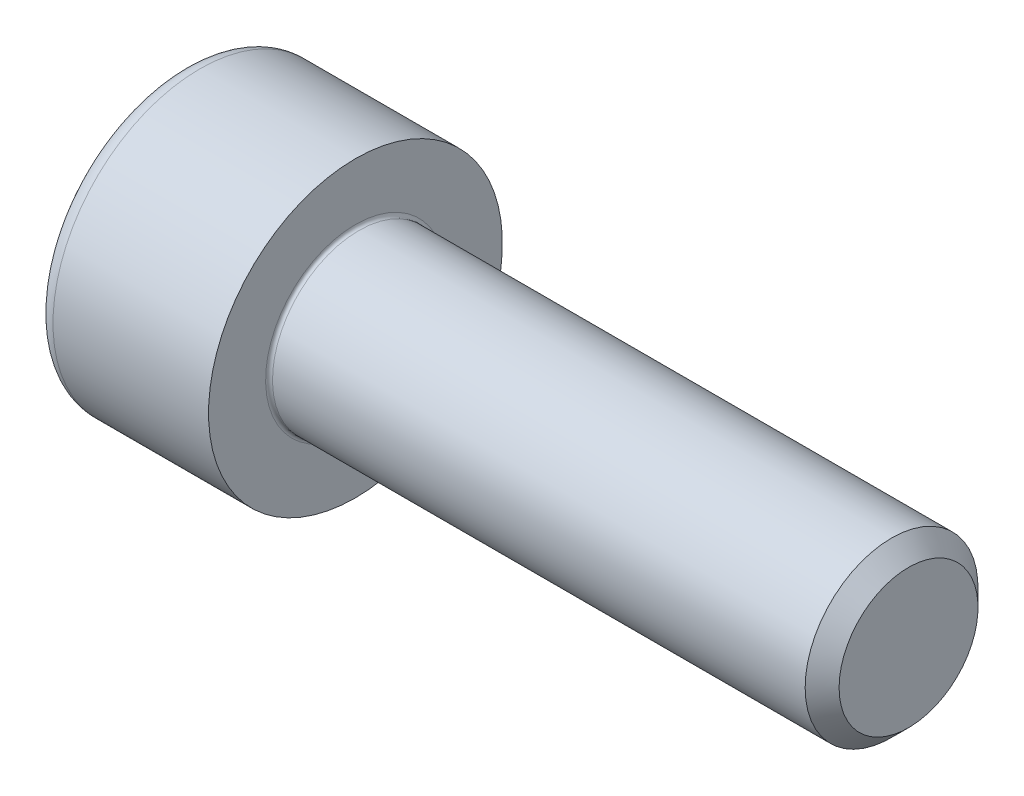
ISO-10303-21;
HEADER;
FILE_DESCRIPTION(('STEP AP214'),'2;1');
FILE_NAME('part.step','',(''),(''),'','','');
FILE_SCHEMA(('AUTOMOTIVE_DESIGN { 1 0 10303 214 1 1 1 1 }'));
ENDSEC;
DATA;
#1=APPLICATION_CONTEXT('core data for automotive mechanical design processes');
#2=APPLICATION_PROTOCOL_DEFINITION('international standard','automotive_design',2000,#1);
#3=PRODUCT_CONTEXT('',#1,'mechanical');
#4=PRODUCT('Part','Part','',(#3));
#5=PRODUCT_RELATED_PRODUCT_CATEGORY('part','',(#4));
#6=PRODUCT_DEFINITION_FORMATION('','',#4);
#7=PRODUCT_DEFINITION_CONTEXT('part definition',#1,'design');
#8=PRODUCT_DEFINITION('design','',#6,#7);
#9=PRODUCT_DEFINITION_SHAPE('','',#8);
#10=(LENGTH_UNIT() NAMED_UNIT(*) SI_UNIT(.MILLI.,.METRE.));
#11=(NAMED_UNIT(*) PLANE_ANGLE_UNIT() SI_UNIT($,.RADIAN.));
#12=(NAMED_UNIT(*) SI_UNIT($,.STERADIAN.) SOLID_ANGLE_UNIT());
#13=UNCERTAINTY_MEASURE_WITH_UNIT(LENGTH_MEASURE(1.E-05),#10,'distance_accuracy_value','');
#14=(GEOMETRIC_REPRESENTATION_CONTEXT(3) GLOBAL_UNCERTAINTY_ASSIGNED_CONTEXT((#13)) GLOBAL_UNIT_ASSIGNED_CONTEXT((#10,
#11,#12)) REPRESENTATION_CONTEXT('',''));
#15=CARTESIAN_POINT('',(0.,0.,0.));
#16=DIRECTION('',(0.,0.,1.));
#17=DIRECTION('',(1.,0.,0.));
#18=AXIS2_PLACEMENT_3D('',#15,#16,#17);
#19=CARTESIAN_POINT('',(-2.50800000134177,0.,0.));
#20=DIRECTION('',(-1.,0.,0.));
#21=DIRECTION('',(0.,0.,1.));
#22=AXIS2_PLACEMENT_3D('',#19,#20,#21);
#23=CONICAL_SURFACE('',#22,2.32325748231688,1.04719754999306);
#24=CARTESIAN_POINT('',(-1.16666666480114,0.,0.));
#25=VERTEX_POINT('',#24);
#26=VERTEX_LOOP('',#25);
#27=FACE_BOUND('',#26,.T.);
#28=CARTESIAN_POINT('',(-2.50000000149329,2.00000000034012,1.15470053794817));
#29=CARTESIAN_POINT('',(-2.47069554668119,2.00000000012216,1.05321634683028));
#30=CARTESIAN_POINT('',(-2.44404467864461,2.00000000003274,0.950856145634218));
#31=CARTESIAN_POINT('',(-2.39752638887454,1.99999999996718,0.744363444835553));
#32=CARTESIAN_POINT('',(-2.37767542175251,1.99999999999131,0.640227277451577));
#33=CARTESIAN_POINT('',(-2.34677596028924,2.00000000000847,0.433245450002578));
#34=CARTESIAN_POINT('',(-2.33552178892674,2.00000000000226,0.330431627824063));
#35=CARTESIAN_POINT('',(-2.32208916945702,1.99999999999774,0.124320462859062));
#36=CARTESIAN_POINT('',(-2.31989959531066,1.99999999999944,0.0210238687165898));
#37=CARTESIAN_POINT('',(-2.32446629153409,2.00000000000049,-0.171974735955581));
#38=CARTESIAN_POINT('',(-2.33010128661813,2.00000000000013,-0.261705707498746));
#39=CARTESIAN_POINT('',(-2.34795730216982,1.99999999999987,-0.440583082572412));
#40=CARTESIAN_POINT('',(-2.36018441624762,1.99999999999996,-0.529728867875609));
#41=CARTESIAN_POINT('',(-2.39074983487721,2.00000000000004,-0.708974747210316));
#42=CARTESIAN_POINT('',(-2.40921764379032,2.00000000000002,-0.799052166700933));
#43=CARTESIAN_POINT('',(-2.45113176248065,1.99999999999998,-0.977863889537872));
#44=CARTESIAN_POINT('',(-2.47456823042956,1.99999999999996,-1.06660048190195));
#45=CARTESIAN_POINT('',(-2.50000000171445,2.,-1.15470053794294));
#46=B_SPLINE_CURVE_WITH_KNOTS('',3,(#28,#29,#30,#31,#32,#33,#34,#35,#36,#37,#38,#39,#40,#41,#42,
#43,#44,#45),.UNSPECIFIED.,.F.,.F.,(4,2,2,2,2,2,2,2,4),(0.,0.317016011610323,0.634793817145274,
0.944707606303263,1.25424088907513,1.5237077825656,1.79342419348694,2.06912162195376,
2.34427797274837),.UNSPECIFIED.);
#47=CARTESIAN_POINT('',(-2.50000000169884,1.99999999978765,1.15470053825665));
#48=VERTEX_POINT('',#47);
#49=CARTESIAN_POINT('',(-2.50000000176962,2.,-1.15470053813405));
#50=VERTEX_POINT('',#49);
#51=EDGE_CURVE('E21',#48,#50,#46,.T.);
#52=ORIENTED_EDGE('',*,*,#51,.T.);
#53=CARTESIAN_POINT('',(-2.50000000149329,1.99999999979674,-1.15470053888935));
#54=CARTESIAN_POINT('',(-2.4706955466812,1.91211211209714,-1.20544263425953));
#55=CARTESIAN_POINT('',(-2.44404467864461,1.82346557748016,-1.25662273478012));
#56=CARTESIAN_POINT('',(-2.39752638887454,1.64463765285968,-1.35986908512268));
#57=CARTESIAN_POINT('',(-2.37767542175251,1.55445308646447,-1.41193716883556));
#58=CARTESIAN_POINT('',(-2.34677596028924,1.37520156578049,-1.51542808257493));
#59=CARTESIAN_POINT('',(-2.33552178892674,1.28616218391061,-1.5668349936588));
#60=CARTESIAN_POINT('',(-2.32208916945702,1.10766467904506,-1.66989057613739));
#61=CARTESIAN_POINT('',(-2.31989959531066,1.01820720439411,-1.72153887321009));
#62=CARTESIAN_POINT('',(-2.32446629153409,0.851065509853594,-1.81803817554709));
#63=CARTESIAN_POINT('',(-2.33010128661813,0.773356208990774,-1.86290366131836));
#64=CARTESIAN_POINT('',(-2.34795730216982,0.618443858014569,-1.95234234885497));
#65=CARTESIAN_POINT('',(-2.36018441624762,0.541241343301734,-1.99691524150665));
#66=CARTESIAN_POINT('',(-2.39074983487721,0.386009858274237,-2.08653818117407));
#67=CARTESIAN_POINT('',(-2.40921764379032,0.308000524688005,-2.13157689091936));
#68=CARTESIAN_POINT('',(-2.45113176248065,0.153145030216733,-2.2209827523378));
#69=CARTESIAN_POINT('',(-2.47456823042956,0.0762968869841689,-2.26535104851982));
#70=CARTESIAN_POINT('',(-2.50000000171445,3.77860756863965E-10,-2.30940107654035));
#71=B_SPLINE_CURVE_WITH_KNOTS('',3,(#53,#54,#55,#56,#57,#58,#59,#60,#61,#62,#63,#64,#65,#66,#67,
#68,#69,#70),.UNSPECIFIED.,.F.,.F.,(4,2,2,2,2,2,2,2,4),(0.,0.317016011610322,0.634793817145273,
0.944707606303263,1.25424088907513,1.5237077825656,1.79342419348694,2.06912162195376,
2.34427797274837),.UNSPECIFIED.);
#72=CARTESIAN_POINT('',(-2.50000000169884,0.,-2.3094010765133));
#73=VERTEX_POINT('',#72);
#74=EDGE_CURVE('E81',#50,#73,#71,.T.);
#75=ORIENTED_EDGE('',*,*,#74,.T.);
#76=CARTESIAN_POINT('',(-2.50000000149329,-5.43384201159472E-10,-2.30940107683752));
#77=CARTESIAN_POINT('',(-2.4706955466812,-0.0878878880250129,-2.25865898108981));
#78=CARTESIAN_POINT('',(-2.44404467864461,-0.176534422552579,-2.20747888041434));
#79=CARTESIAN_POINT('',(-2.39752638887454,-0.355362347107503,-2.10423252995823));
#80=CARTESIAN_POINT('',(-2.37767542175251,-0.44554691352684,-2.05216444628714));
#81=CARTESIAN_POINT('',(-2.34677596028924,-0.624798434227981,-1.94867353257751));
#82=CARTESIAN_POINT('',(-2.33552178892674,-0.713837816091643,-1.89726662148287));
#83=CARTESIAN_POINT('',(-2.32208916945702,-0.892335320952682,-1.79421103899646));
#84=CARTESIAN_POINT('',(-2.31989959531066,-0.981792795605319,-1.74256274192668));
#85=CARTESIAN_POINT('',(-2.32446629153409,-1.1489344901469,-1.64606343959152));
#86=CARTESIAN_POINT('',(-2.33010128661813,-1.22664379100936,-1.60119795381962));
#87=CARTESIAN_POINT('',(-2.34795730216982,-1.3815561419853,-1.51175926628256));
#88=CARTESIAN_POINT('',(-2.36018441624762,-1.45875865669823,-1.46718637363104));
#89=CARTESIAN_POINT('',(-2.39074983487721,-1.6139901417258,-1.37756343396375));
#90=CARTESIAN_POINT('',(-2.40921764379032,-1.69199947531202,-1.33252472421843));
#91=CARTESIAN_POINT('',(-2.45113176248065,-1.84685496978325,-1.24311886279993));
#92=CARTESIAN_POINT('',(-2.47456823042956,-1.92370311301579,-1.19875056661787));
#93=CARTESIAN_POINT('',(-2.50000000171445,-1.99999999962214,-1.15470053859741));
#94=B_SPLINE_CURVE_WITH_KNOTS('',3,(#76,#77,#78,#79,#80,#81,#82,#83,#84,#85,#86,#87,#88,#89,#90,
#91,#92,#93),.UNSPECIFIED.,.F.,.F.,(4,2,2,2,2,2,2,2,4),(0.,0.317016011610323,0.634793817145273,
0.944707606303263,1.25424088907513,1.5237077825656,1.79342419348695,2.06912162195376,
2.34427797274837),.UNSPECIFIED.);
#95=CARTESIAN_POINT('',(-2.50000000169884,-1.99999999978765,-1.15470053825665));
#96=VERTEX_POINT('',#95);
#97=EDGE_CURVE('E106',#73,#96,#94,.T.);
#98=ORIENTED_EDGE('',*,*,#97,.T.);
#99=CARTESIAN_POINT('',(-2.50000000149329,-2.00000000034012,-1.15470053794818));
#100=CARTESIAN_POINT('',(-2.4706955466812,-2.00000000012216,-1.05321634683028));
#101=CARTESIAN_POINT('',(-2.44404467864461,-2.00000000003274,-0.95085614563422));
#102=CARTESIAN_POINT('',(-2.39752638887454,-1.99999999996718,-0.744363444835555));
#103=CARTESIAN_POINT('',(-2.37767542175251,-1.99999999999131,-0.640227277451579));
#104=CARTESIAN_POINT('',(-2.34677596028924,-2.00000000000847,-0.43324545000258));
#105=CARTESIAN_POINT('',(-2.33552178892674,-2.00000000000226,-0.330431627824065));
#106=CARTESIAN_POINT('',(-2.32208916945702,-1.99999999999774,-0.124320462859064));
#107=CARTESIAN_POINT('',(-2.31989959531066,-1.99999999999944,-0.0210238687165921));
#108=CARTESIAN_POINT('',(-2.32446629153409,-2.00000000000049,0.171974735955579));
#109=CARTESIAN_POINT('',(-2.33010128661813,-2.00000000000013,0.261705707498744));
#110=CARTESIAN_POINT('',(-2.34795730216982,-1.99999999999987,0.440583082572411));
#111=CARTESIAN_POINT('',(-2.36018441624762,-1.99999999999996,0.529728867875608));
#112=CARTESIAN_POINT('',(-2.39074983487721,-2.00000000000004,0.708974747210314));
#113=CARTESIAN_POINT('',(-2.40921764379032,-2.00000000000002,0.799052166700932));
#114=CARTESIAN_POINT('',(-2.45113176248065,-1.99999999999998,0.977863889537871));
#115=CARTESIAN_POINT('',(-2.47456823042956,-1.99999999999996,1.06660048190195));
#116=CARTESIAN_POINT('',(-2.50000000171445,-2.,1.15470053794294));
#117=B_SPLINE_CURVE_WITH_KNOTS('',3,(#99,#100,#101,#102,#103,#104,#105,#106,#107,#108,#109,#110,
#111,#112,#113,#114,#115,#116),.UNSPECIFIED.,.F.,.F.,(4,2,2,2,2,2,2,2,4),(0.,0.317016011610323,
0.634793817145274,0.944707606303263,1.25424088907513,1.5237077825656,1.79342419348695,
2.06912162195376,2.34427797274837),.UNSPECIFIED.);
#118=CARTESIAN_POINT('',(-2.50000000169884,-1.99999999978765,1.15470053825665));
#119=VERTEX_POINT('',#118);
#120=EDGE_CURVE('E130',#96,#119,#117,.T.);
#121=ORIENTED_EDGE('',*,*,#120,.T.);
#122=CARTESIAN_POINT('',(-2.50000000149329,-1.99999999979674,1.15470053888934));
#123=CARTESIAN_POINT('',(-2.4706955466812,-1.91211211209714,1.20544263425953));
#124=CARTESIAN_POINT('',(-2.44404467864461,-1.82346557748016,1.25662273478012));
#125=CARTESIAN_POINT('',(-2.39752638887454,-1.64463765285968,1.35986908512268));
#126=CARTESIAN_POINT('',(-2.37767542175251,-1.55445308646447,1.41193716883556));
#127=CARTESIAN_POINT('',(-2.34677596028924,-1.37520156578049,1.51542808257493));
#128=CARTESIAN_POINT('',(-2.33552178892674,-1.28616218391062,1.5668349936588));
#129=CARTESIAN_POINT('',(-2.32208916945702,-1.10766467904506,1.66989057613739));
#130=CARTESIAN_POINT('',(-2.31989959531066,-1.01820720439412,1.72153887321009));
#131=CARTESIAN_POINT('',(-2.32446629153409,-0.851065509853595,1.81803817554709));
#132=CARTESIAN_POINT('',(-2.33010128661813,-0.773356208990775,1.86290366131836));
#133=CARTESIAN_POINT('',(-2.34795730216982,-0.61844385801457,1.95234234885497));
#134=CARTESIAN_POINT('',(-2.36018441624762,-0.541241343301735,1.99691524150665));
#135=CARTESIAN_POINT('',(-2.39074983487721,-0.386009858274237,2.08653818117407));
#136=CARTESIAN_POINT('',(-2.40921764379032,-0.308000524688005,2.13157689091936));
#137=CARTESIAN_POINT('',(-2.45113176248065,-0.153145030216734,2.2209827523378));
#138=CARTESIAN_POINT('',(-2.47456823042956,-0.0762968869841696,2.26535104851982));
#139=CARTESIAN_POINT('',(-2.50000000171445,-3.7786149508116E-10,2.30940107654035));
#140=B_SPLINE_CURVE_WITH_KNOTS('',3,(#122,#123,#124,#125,#126,#127,#128,#129,#130,#131,#132,
#133,#134,#135,#136,#137,#138,#139),.UNSPECIFIED.,.F.,.F.,(4,2,2,2,2,2,2,2,4),(0.,
0.317016011610323,0.634793817145273,0.944707606303263,1.25424088907513,1.5237077825656,
1.79342419348695,2.06912162195376,2.34427797274837),.UNSPECIFIED.);
#141=CARTESIAN_POINT('',(-2.50000000169884,0.,2.3094010765133));
#142=VERTEX_POINT('',#141);
#143=EDGE_CURVE('E138',#119,#142,#140,.T.);
#144=ORIENTED_EDGE('',*,*,#143,.T.);
#145=CARTESIAN_POINT('',(-2.50000000149329,5.43384277631809E-10,2.30940107683752));
#146=CARTESIAN_POINT('',(-2.47069554668119,0.0878878880250131,2.25865898108981));
#147=CARTESIAN_POINT('',(-2.44404467864461,0.176534422552579,2.20747888041434));
#148=CARTESIAN_POINT('',(-2.39752638887454,0.355362347107503,2.10423252995823));
#149=CARTESIAN_POINT('',(-2.37767542175251,0.44554691352684,2.05216444628714));
#150=CARTESIAN_POINT('',(-2.34677596028924,0.624798434227981,1.9486735325775));
#151=CARTESIAN_POINT('',(-2.33552178892674,0.713837816091643,1.89726662148287));
#152=CARTESIAN_POINT('',(-2.32208916945702,0.892335320952682,1.79421103899645));
#153=CARTESIAN_POINT('',(-2.31989959531066,0.981792795605319,1.74256274192668));
#154=CARTESIAN_POINT('',(-2.32446629153409,1.1489344901469,1.64606343959151));
#155=CARTESIAN_POINT('',(-2.33010128661813,1.22664379100936,1.60119795381962));
#156=CARTESIAN_POINT('',(-2.34795730216982,1.3815561419853,1.51175926628256));
#157=CARTESIAN_POINT('',(-2.36018441624761,1.45875865669823,1.46718637363104));
#158=CARTESIAN_POINT('',(-2.39074983487721,1.6139901417258,1.37756343396375));
#159=CARTESIAN_POINT('',(-2.40921764379032,1.69199947531201,1.33252472421843));
#160=CARTESIAN_POINT('',(-2.45113176248065,1.84685496978325,1.24311886279992));
#161=CARTESIAN_POINT('',(-2.47456823042956,1.92370311301579,1.19875056661787));
#162=CARTESIAN_POINT('',(-2.50000000171445,1.99999999962214,1.15470053859741));
#163=B_SPLINE_CURVE_WITH_KNOTS('',3,(#145,#146,#147,#148,#149,#150,#151,#152,#153,#154,#155,
#156,#157,#158,#159,#160,#161,#162),.UNSPECIFIED.,.F.,.F.,(4,2,2,2,2,2,2,2,4),(0.,
0.317016011610323,0.634793817145273,0.944707606303263,1.25424088907513,1.5237077825656,
1.79342419348695,2.06912162195376,2.34427797274837),.UNSPECIFIED.);
#164=EDGE_CURVE('E83',#142,#48,#163,.T.);
#165=ORIENTED_EDGE('',*,*,#164,.T.);
#166=EDGE_LOOP('',(#52,#75,#98,#121,#144,#165));
#167=FACE_BOUND('',#166,.T.);
#168=ADVANCED_FACE('F17',(#27,#167),#23,.F.);
#169=CARTESIAN_POINT('',(-5.,2.,1.15470053837925));
#170=DIRECTION('',(0.,1.,0.));
#171=DIRECTION('',(0.,0.,1.));
#172=AXIS2_PLACEMENT_3D('',#169,#170,#171);
#173=PLANE('',#172);
#174=DIRECTION('',(1.,0.,0.));
#175=VECTOR('',#174,1.);
#176=CARTESIAN_POINT('',(-5.,2.,1.15470053837925));
#177=LINE('',#176,#175);
#178=CARTESIAN_POINT('',(-5.,2.,1.15470053837925));
#179=VERTEX_POINT('',#178);
#180=EDGE_CURVE('E85',#48,#179,#177,.F.);
#181=ORIENTED_EDGE('',*,*,#180,.T.);
#182=DIRECTION('',(0.,0.,1.));
#183=VECTOR('',#182,1.);
#184=CARTESIAN_POINT('',(-5.,2.,0.));
#185=LINE('',#184,#183);
#186=CARTESIAN_POINT('',(-5.,2.,-1.15470053837925));
#187=VERTEX_POINT('',#186);
#188=EDGE_CURVE('E90',#187,#179,#185,.T.);
#189=ORIENTED_EDGE('',*,*,#188,.F.);
#190=DIRECTION('',(1.,0.,0.));
#191=VECTOR('',#190,1.);
#192=CARTESIAN_POINT('',(-5.,2.,-1.15470053837925));
#193=LINE('',#192,#191);
#194=EDGE_CURVE('E88',#187,#50,#193,.T.);
#195=ORIENTED_EDGE('',*,*,#194,.T.);
#196=ORIENTED_EDGE('',*,*,#51,.F.);
#197=EDGE_LOOP('',(#181,#189,#195,#196));
#198=FACE_BOUND('',#197,.T.);
#199=ADVANCED_FACE('F77',(#198),#173,.F.);
#200=CARTESIAN_POINT('',(-5.,0.,2.3094010767585));
#201=DIRECTION('',(0.,0.500000000000001,0.866025403784438));
#202=DIRECTION('',(0.,-0.866025403784438,0.500000000000001));
#203=AXIS2_PLACEMENT_3D('',#200,#201,#202);
#204=PLANE('',#203);
#205=DIRECTION('',(1.,0.,0.));
#206=VECTOR('',#205,1.);
#207=CARTESIAN_POINT('',(-5.,0.,2.3094010767585));
#208=LINE('',#207,#206);
#209=CARTESIAN_POINT('',(-5.,0.,2.3094010767585));
#210=VERTEX_POINT('',#209);
#211=EDGE_CURVE('E142',#142,#210,#208,.F.);
#212=ORIENTED_EDGE('',*,*,#211,.T.);
#213=DIRECTION('',(0.,-0.866025403784438,0.5));
#214=VECTOR('',#213,1.);
#215=CARTESIAN_POINT('',(-5.,2.,1.15470053837925));
#216=LINE('',#215,#214);
#217=EDGE_CURVE('E96',#179,#210,#216,.T.);
#218=ORIENTED_EDGE('',*,*,#217,.F.);
#219=ORIENTED_EDGE('',*,*,#180,.F.);
#220=ORIENTED_EDGE('',*,*,#164,.F.);
#221=EDGE_LOOP('',(#212,#218,#219,#220));
#222=FACE_BOUND('',#221,.T.);
#223=ADVANCED_FACE('F146',(#222),#204,.F.);
#224=CARTESIAN_POINT('',(-5.,-2.,1.15470053837925));
#225=DIRECTION('',(0.,-0.5,0.866025403784439));
#226=DIRECTION('',(0.,-0.866025403784439,-0.5));
#227=AXIS2_PLACEMENT_3D('',#224,#225,#226);
#228=PLANE('',#227);
#229=DIRECTION('',(1.,0.,0.));
#230=VECTOR('',#229,1.);
#231=CARTESIAN_POINT('',(-5.,-2.,1.15470053837925));
#232=LINE('',#231,#230);
#233=CARTESIAN_POINT('',(-5.,-2.,1.15470053837925));
#234=VERTEX_POINT('',#233);
#235=EDGE_CURVE('E137',#119,#234,#232,.F.);
#236=ORIENTED_EDGE('',*,*,#235,.T.);
#237=DIRECTION('',(0.,-0.866025403784439,-0.5));
#238=VECTOR('',#237,1.);
#239=CARTESIAN_POINT('',(-5.,0.,2.3094010767585));
#240=LINE('',#239,#238);
#241=EDGE_CURVE('E265',#210,#234,#240,.T.);
#242=ORIENTED_EDGE('',*,*,#241,.F.);
#243=ORIENTED_EDGE('',*,*,#211,.F.);
#244=ORIENTED_EDGE('',*,*,#143,.F.);
#245=EDGE_LOOP('',(#236,#242,#243,#244));
#246=FACE_BOUND('',#245,.T.);
#247=ADVANCED_FACE('F126',(#246),#228,.F.);
#248=CARTESIAN_POINT('',(-5.,-2.,-1.15470053837925));
#249=DIRECTION('',(0.,-1.,0.));
#250=DIRECTION('',(0.,0.,-1.));
#251=AXIS2_PLACEMENT_3D('',#248,#249,#250);
#252=PLANE('',#251);
#253=DIRECTION('',(1.,0.,0.));
#254=VECTOR('',#253,1.);
#255=CARTESIAN_POINT('',(-5.,-2.,-1.15470053837925));
#256=LINE('',#255,#254);
#257=CARTESIAN_POINT('',(-5.,-2.,-1.15470053837925));
#258=VERTEX_POINT('',#257);
#259=EDGE_CURVE('E136',#96,#258,#256,.F.);
#260=ORIENTED_EDGE('',*,*,#259,.T.);
#261=DIRECTION('',(0.,0.,1.));
#262=VECTOR('',#261,1.);
#263=CARTESIAN_POINT('',(-5.,-2.,0.));
#264=LINE('',#263,#262);
#265=EDGE_CURVE('E260',#234,#258,#264,.F.);
#266=ORIENTED_EDGE('',*,*,#265,.F.);
#267=ORIENTED_EDGE('',*,*,#235,.F.);
#268=ORIENTED_EDGE('',*,*,#120,.F.);
#269=EDGE_LOOP('',(#260,#266,#267,#268));
#270=FACE_BOUND('',#269,.T.);
#271=ADVANCED_FACE('F122',(#270),#252,.F.);
#272=CARTESIAN_POINT('',(-5.,0.,-2.3094010767585));
#273=DIRECTION('',(0.,-0.5,-0.866025403784439));
#274=DIRECTION('',(0.,0.866025403784439,-0.5));
#275=AXIS2_PLACEMENT_3D('',#272,#273,#274);
#276=PLANE('',#275);
#277=DIRECTION('',(1.,0.,0.));
#278=VECTOR('',#277,1.);
#279=CARTESIAN_POINT('',(-5.,0.,-2.3094010767585));
#280=LINE('',#279,#278);
#281=CARTESIAN_POINT('',(-5.,0.,-2.3094010767585));
#282=VERTEX_POINT('',#281);
#283=EDGE_CURVE('E39',#73,#282,#280,.F.);
#284=ORIENTED_EDGE('',*,*,#283,.T.);
#285=DIRECTION('',(0.,0.866025403784439,-0.5));
#286=VECTOR('',#285,1.);
#287=CARTESIAN_POINT('',(-5.,-2.,-1.15470053837925));
#288=LINE('',#287,#286);
#289=EDGE_CURVE('E255',#258,#282,#288,.T.);
#290=ORIENTED_EDGE('',*,*,#289,.F.);
#291=ORIENTED_EDGE('',*,*,#259,.F.);
#292=ORIENTED_EDGE('',*,*,#97,.F.);
#293=EDGE_LOOP('',(#284,#290,#291,#292));
#294=FACE_BOUND('',#293,.T.);
#295=ADVANCED_FACE('F116',(#294),#276,.F.);
#296=CARTESIAN_POINT('',(-5.,2.,-1.15470053837925));
#297=DIRECTION('',(0.,0.5,-0.866025403784439));
#298=DIRECTION('',(0.,0.866025403784439,0.5));
#299=AXIS2_PLACEMENT_3D('',#296,#297,#298);
#300=PLANE('',#299);
#301=ORIENTED_EDGE('',*,*,#194,.F.);
#302=DIRECTION('',(0.,0.866025403784439,0.5));
#303=VECTOR('',#302,1.);
#304=CARTESIAN_POINT('',(-5.,0.,-2.3094010767585));
#305=LINE('',#304,#303);
#306=EDGE_CURVE('E253',#282,#187,#305,.T.);
#307=ORIENTED_EDGE('',*,*,#306,.F.);
#308=ORIENTED_EDGE('',*,*,#283,.F.);
#309=ORIENTED_EDGE('',*,*,#74,.F.);
#310=EDGE_LOOP('',(#301,#307,#308,#309));
#311=FACE_BOUND('',#310,.T.);
#312=ADVANCED_FACE('F94',(#311),#300,.F.);
#313=CARTESIAN_POINT('',(-5.,3.27970053837925,0.));
#314=DIRECTION('',(-1.,0.,0.));
#315=DIRECTION('',(0.,0.,1.));
#316=AXIS2_PLACEMENT_3D('',#313,#314,#315);
#317=PLANE('',#316);
#318=ORIENTED_EDGE('',*,*,#289,.T.);
#319=ORIENTED_EDGE('',*,*,#306,.T.);
#320=ORIENTED_EDGE('',*,*,#188,.T.);
#321=ORIENTED_EDGE('',*,*,#217,.T.);
#322=ORIENTED_EDGE('',*,*,#241,.T.);
#323=ORIENTED_EDGE('',*,*,#265,.T.);
#324=EDGE_LOOP('',(#318,#319,#320,#321,#322,#323));
#325=FACE_BOUND('',#324,.T.);
#326=CARTESIAN_POINT('',(-5.,0.,0.));
#327=DIRECTION('',(1.,0.,0.));
#328=DIRECTION('',(0.,1.,0.));
#329=AXIS2_PLACEMENT_3D('',#326,#327,#328);
#330=CIRCLE('',#329,3.75);
#331=CARTESIAN_POINT('',(-5.,3.75,0.));
#332=VERTEX_POINT('',#331);
#333=EDGE_CURVE('E216',#332,#332,#330,.T.);
#334=ORIENTED_EDGE('',*,*,#333,.F.);
#335=EDGE_LOOP('',(#334));
#336=FACE_BOUND('',#335,.T.);
#337=ADVANCED_FACE('F115',(#325,#336),#317,.T.);
#338=CARTESIAN_POINT('',(-4.5,0.,0.));
#339=DIRECTION('',(1.,0.,0.));
#340=DIRECTION('',(0.,0.,-1.));
#341=AXIS2_PLACEMENT_3D('',#338,#339,#340);
#342=TOROIDAL_SURFACE('',#341,3.75,0.5);
#343=CARTESIAN_POINT('',(-4.5,0.,0.));
#344=DIRECTION('',(1.,0.,0.));
#345=DIRECTION('',(0.,1.,0.));
#346=AXIS2_PLACEMENT_3D('',#343,#344,#345);
#347=CIRCLE('',#346,4.25);
#348=CARTESIAN_POINT('',(-4.5,4.25,0.));
#349=VERTEX_POINT('',#348);
#350=EDGE_CURVE('E280',#349,#349,#347,.T.);
#351=ORIENTED_EDGE('',*,*,#350,.F.);
#352=EDGE_LOOP('',(#351));
#353=FACE_BOUND('',#352,.T.);
#354=ORIENTED_EDGE('',*,*,#333,.T.);
#355=EDGE_LOOP('',(#354));
#356=FACE_BOUND('',#355,.T.);
#357=ADVANCED_FACE('F200',(#353,#356),#342,.T.);
#358=CARTESIAN_POINT('',(-2.5,0.,0.));
#359=DIRECTION('',(1.,0.,0.));
#360=DIRECTION('',(0.,1.,0.));
#361=AXIS2_PLACEMENT_3D('',#358,#359,#360);
#362=CYLINDRICAL_SURFACE('',#361,4.25);
#363=ORIENTED_EDGE('',*,*,#350,.T.);
#364=EDGE_LOOP('',(#363));
#365=FACE_BOUND('',#364,.T.);
#366=CARTESIAN_POINT('',(0.,0.,0.));
#367=DIRECTION('',(1.,0.,0.));
#368=DIRECTION('',(0.,1.,0.));
#369=AXIS2_PLACEMENT_3D('',#366,#367,#368);
#370=CIRCLE('',#369,4.25);
#371=CARTESIAN_POINT('',(0.,4.25,0.));
#372=VERTEX_POINT('',#371);
#373=EDGE_CURVE('E104',#372,#372,#370,.T.);
#374=ORIENTED_EDGE('',*,*,#373,.F.);
#375=EDGE_LOOP('',(#374));
#376=FACE_BOUND('',#375,.T.);
#377=ADVANCED_FACE('F197',(#365,#376),#362,.T.);
#378=CARTESIAN_POINT('',(16.,1.25,0.));
#379=DIRECTION('',(1.,0.,0.));
#380=DIRECTION('',(0.,0.,-1.));
#381=AXIS2_PLACEMENT_3D('',#378,#379,#380);
#382=PLANE('',#381);
#383=CARTESIAN_POINT('',(16.0000000001901,0.,0.));
#384=DIRECTION('',(-1.,0.,0.));
#385=DIRECTION('',(0.,0.,1.));
#386=AXIS2_PLACEMENT_3D('',#383,#384,#385);
#387=CIRCLE('',#386,2.00924000017721);
#388=CARTESIAN_POINT('',(16.0000000001901,0.,2.00924000017721));
#389=VERTEX_POINT('',#388);
#390=EDGE_CURVE('E275',#389,#389,#387,.T.);
#391=ORIENTED_EDGE('',*,*,#390,.F.);
#392=EDGE_LOOP('',(#391));
#393=FACE_BOUND('',#392,.T.);
#394=ADVANCED_FACE('F194',(#393),#382,.T.);
#395=CARTESIAN_POINT('',(0.,3.375,0.));
#396=DIRECTION('',(1.,0.,0.));
#397=DIRECTION('',(0.,0.,-1.));
#398=AXIS2_PLACEMENT_3D('',#395,#396,#397);
#399=PLANE('',#398);
#400=CARTESIAN_POINT('',(0.,0.,0.));
#401=DIRECTION('',(1.,0.,0.));
#402=DIRECTION('',(0.,1.,0.));
#403=AXIS2_PLACEMENT_3D('',#400,#401,#402);
#404=CIRCLE('',#403,2.6);
#405=CARTESIAN_POINT('',(0.,2.6,0.));
#406=VERTEX_POINT('',#405);
#407=EDGE_CURVE('E181',#406,#406,#404,.F.);
#408=ORIENTED_EDGE('',*,*,#407,.T.);
#409=EDGE_LOOP('',(#408));
#410=FACE_BOUND('',#409,.T.);
#411=ORIENTED_EDGE('',*,*,#373,.T.);
#412=EDGE_LOOP('',(#411));
#413=FACE_BOUND('',#412,.T.);
#414=ADVANCED_FACE('F185',(#410,#413),#399,.T.);
#415=CARTESIAN_POINT('',(15.509239999858,0.,0.));
#416=DIRECTION('',(-1.,0.,0.));
#417=DIRECTION('',(0.,0.,1.));
#418=AXIS2_PLACEMENT_3D('',#415,#416,#417);
#419=CONICAL_SURFACE('',#418,2.49999999959982,0.78539816247083);
#420=ORIENTED_EDGE('',*,*,#390,.T.);
#421=EDGE_LOOP('',(#420));
#422=FACE_BOUND('',#421,.T.);
#423=CARTESIAN_POINT('',(15.50924,0.,0.));
#424=DIRECTION('',(1.,0.,0.));
#425=DIRECTION('',(0.,1.,0.));
#426=AXIS2_PLACEMENT_3D('',#423,#424,#425);
#427=CIRCLE('',#426,2.5);
#428=CARTESIAN_POINT('',(15.50924,2.5,0.));
#429=VERTEX_POINT('',#428);
#430=EDGE_CURVE('E30',#429,#429,#427,.F.);
#431=ORIENTED_EDGE('',*,*,#430,.F.);
#432=EDGE_LOOP('',(#431));
#433=FACE_BOUND('',#432,.T.);
#434=ADVANCED_FACE('F163',(#422,#433),#419,.T.);
#435=CARTESIAN_POINT('',(0.100000000000002,0.,0.));
#436=DIRECTION('',(1.,0.,0.));
#437=DIRECTION('',(0.,0.,-1.));
#438=AXIS2_PLACEMENT_3D('',#435,#436,#437);
#439=TOROIDAL_SURFACE('',#438,2.6,0.1);
#440=CARTESIAN_POINT('',(0.100000000000003,0.,0.));
#441=DIRECTION('',(1.,0.,0.));
#442=DIRECTION('',(0.,1.,0.));
#443=AXIS2_PLACEMENT_3D('',#440,#441,#442);
#444=CIRCLE('',#443,2.5);
#445=CARTESIAN_POINT('',(0.100000000000003,2.5,0.));
#446=VERTEX_POINT('',#445);
#447=EDGE_CURVE('E11',#446,#446,#444,.T.);
#448=ORIENTED_EDGE('',*,*,#447,.F.);
#449=EDGE_LOOP('',(#448));
#450=FACE_BOUND('',#449,.T.);
#451=ORIENTED_EDGE('',*,*,#407,.F.);
#452=EDGE_LOOP('',(#451));
#453=FACE_BOUND('',#452,.T.);
#454=ADVANCED_FACE('F157',(#450,#453),#439,.F.);
#455=CARTESIAN_POINT('',(9.,0.,0.));
#456=DIRECTION('',(1.,0.,0.));
#457=DIRECTION('',(0.,1.,0.));
#458=AXIS2_PLACEMENT_3D('',#455,#456,#457);
#459=CYLINDRICAL_SURFACE('',#458,2.5);
#460=ORIENTED_EDGE('',*,*,#447,.T.);
#461=EDGE_LOOP('',(#460));
#462=FACE_BOUND('',#461,.T.);
#463=ORIENTED_EDGE('',*,*,#430,.T.);
#464=EDGE_LOOP('',(#463));
#465=FACE_BOUND('',#464,.T.);
#466=ADVANCED_FACE('F155',(#462,#465),#459,.T.);
#467=CLOSED_SHELL('',(#168,#199,#223,#247,#271,#295,#312,#337,#357,#377,#394,#414,#434,#454,#466));
#468=MANIFOLD_SOLID_BREP('B1',#467);
#469=ADVANCED_BREP_SHAPE_REPRESENTATION('',(#18,#468),#14);
#470=SHAPE_DEFINITION_REPRESENTATION(#9,#469);
ENDSEC;
END-ISO-10303-21;
